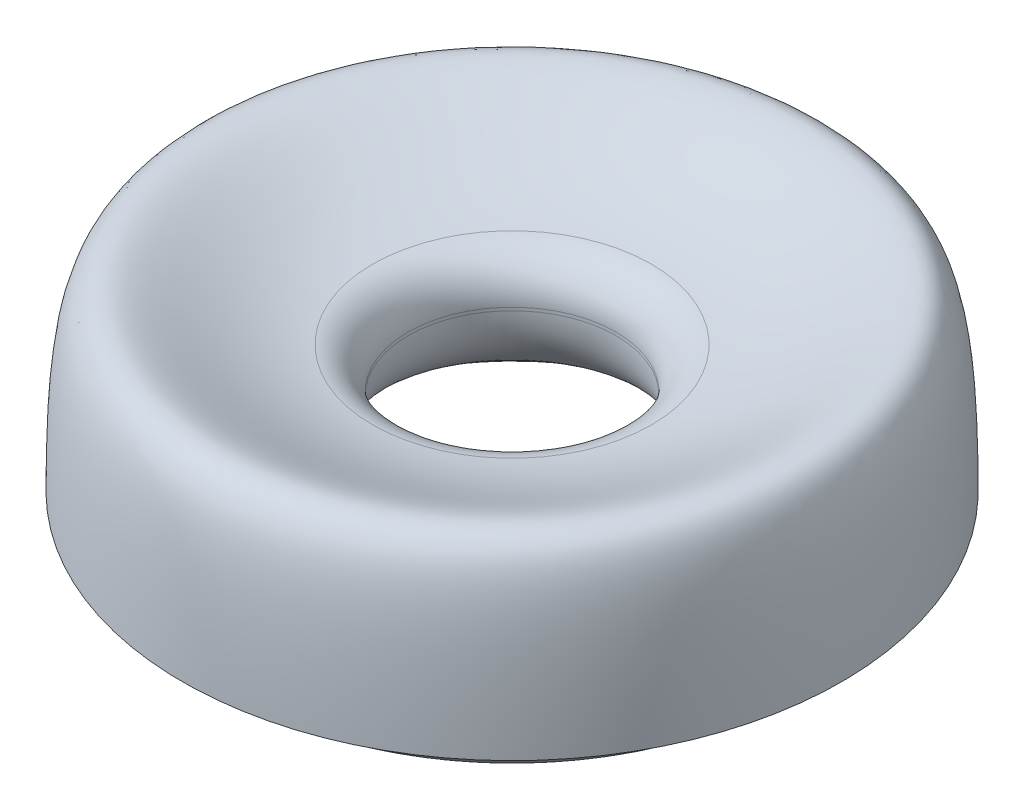
ISO-10303-21;
HEADER;
FILE_DESCRIPTION(('STEP AP214'),'2;1');
FILE_NAME('part.step','',(''),(''),'','','');
FILE_SCHEMA(('AUTOMOTIVE_DESIGN { 1 0 10303 214 1 1 1 1 }'));
ENDSEC;
DATA;
#1=APPLICATION_CONTEXT('core data for automotive mechanical design processes');
#2=APPLICATION_PROTOCOL_DEFINITION('international standard','automotive_design',2000,#1);
#3=PRODUCT_CONTEXT('',#1,'mechanical');
#4=PRODUCT('Part','Part','',(#3));
#5=PRODUCT_RELATED_PRODUCT_CATEGORY('part','',(#4));
#6=PRODUCT_DEFINITION_FORMATION('','',#4);
#7=PRODUCT_DEFINITION_CONTEXT('part definition',#1,'design');
#8=PRODUCT_DEFINITION('design','',#6,#7);
#9=PRODUCT_DEFINITION_SHAPE('','',#8);
#10=(LENGTH_UNIT() NAMED_UNIT(*) SI_UNIT(.MILLI.,.METRE.));
#11=(NAMED_UNIT(*) PLANE_ANGLE_UNIT() SI_UNIT($,.RADIAN.));
#12=(NAMED_UNIT(*) SI_UNIT($,.STERADIAN.) SOLID_ANGLE_UNIT());
#13=UNCERTAINTY_MEASURE_WITH_UNIT(LENGTH_MEASURE(1.E-05),#10,'distance_accuracy_value','');
#14=(GEOMETRIC_REPRESENTATION_CONTEXT(3) GLOBAL_UNCERTAINTY_ASSIGNED_CONTEXT((#13)) GLOBAL_UNIT_ASSIGNED_CONTEXT((#10,
#11,#12)) REPRESENTATION_CONTEXT('',''));
#15=CARTESIAN_POINT('',(0.,0.,0.));
#16=DIRECTION('',(0.,0.,1.));
#17=DIRECTION('',(1.,0.,0.));
#18=AXIS2_PLACEMENT_3D('',#15,#16,#17);
#19=CARTESIAN_POINT('',(0.,111.,1.02695629777827E-12));
#20=DIRECTION('',(0.,1.,0.));
#21=DIRECTION('',(0.,0.,1.));
#22=AXIS2_PLACEMENT_3D('',#19,#20,#21);
#23=PLANE('',#22);
#24=CARTESIAN_POINT('',(0.,111.,0.));
#25=DIRECTION('',(0.,1.,0.));
#26=DIRECTION('',(0.,0.,1.));
#27=AXIS2_PLACEMENT_3D('',#24,#25,#26);
#28=CIRCLE('',#27,5.5752694107408);
#29=CARTESIAN_POINT('',(0.,111.,5.5752694107408));
#30=VERTEX_POINT('',#29);
#31=EDGE_CURVE('E10',#30,#30,#28,.T.);
#32=ORIENTED_EDGE('',*,*,#31,.T.);
#33=EDGE_LOOP('',(#32));
#34=FACE_BOUND('',#33,.T.);
#35=CARTESIAN_POINT('',(0.,111.,0.));
#36=DIRECTION('',(0.,-1.,0.));
#37=DIRECTION('',(0.,0.,-1.));
#38=AXIS2_PLACEMENT_3D('',#35,#36,#37);
#39=CIRCLE('',#38,6.42816439104218);
#40=CARTESIAN_POINT('',(0.,111.,-6.42816439104218));
#41=VERTEX_POINT('',#40);
#42=EDGE_CURVE('E71',#41,#41,#39,.T.);
#43=ORIENTED_EDGE('',*,*,#42,.T.);
#44=EDGE_LOOP('',(#43));
#45=FACE_BOUND('',#44,.T.);
#46=ADVANCED_FACE('F39',(#34,#45),#23,.F.);
#47=CARTESIAN_POINT('',(0.,111.,4.92816439104217));
#48=CARTESIAN_POINT('',(0.,112.000000179911,4.92816439104217));
#49=CARTESIAN_POINT('',(0.,112.000000179911,2.5));
#50=CARTESIAN_POINT('',(0.,114.,2.5));
#51=B_SPLINE_CURVE_WITH_KNOTS('',3,(#47,#48,#49,#50),.UNSPECIFIED.,.F.,.F.,(4,4),(0.,1.),.UNSPECIFIED.);
#52=CARTESIAN_POINT('',(0.,103.198398653891,0.));
#53=DIRECTION('',(0.,-1.,0.));
#54=AXIS1_PLACEMENT('',#52,#53);
#55=SURFACE_OF_REVOLUTION('',#51,#54);
#56=CARTESIAN_POINT('',(0.,111.383129300292,0.));
#57=DIRECTION('',(0.,-1.,0.));
#58=DIRECTION('',(0.,0.,-1.));
#59=AXIS2_PLACEMENT_3D('',#56,#57,#58);
#60=CIRCLE('',#59,4.78820490268415);
#61=CARTESIAN_POINT('',(0.,111.383129300292,-4.78820490268415));
#62=VERTEX_POINT('',#61);
#63=EDGE_CURVE('E46',#62,#62,#60,.T.);
#64=ORIENTED_EDGE('',*,*,#63,.T.);
#65=EDGE_LOOP('',(#64));
#66=FACE_BOUND('',#65,.T.);
#67=CARTESIAN_POINT('',(0.,114.,0.));
#68=DIRECTION('',(0.,-1.,0.));
#69=DIRECTION('',(0.,0.,-1.));
#70=AXIS2_PLACEMENT_3D('',#67,#68,#69);
#71=CIRCLE('',#70,2.5);
#72=CARTESIAN_POINT('',(0.,114.,-2.5));
#73=VERTEX_POINT('',#72);
#74=EDGE_CURVE('E59',#73,#73,#71,.T.);
#75=ORIENTED_EDGE('',*,*,#74,.F.);
#76=EDGE_LOOP('',(#75));
#77=FACE_BOUND('',#76,.T.);
#78=ADVANCED_FACE('F95',(#66,#77),#55,.T.);
#79=CARTESIAN_POINT('',(0.,103.198398653891,0.));
#80=DIRECTION('',(0.,-1.,0.));
#81=DIRECTION('',(0.,0.,-1.));
#82=AXIS2_PLACEMENT_3D('',#79,#80,#81);
#83=CYLINDRICAL_SURFACE('',#82,2.5);
#84=CARTESIAN_POINT('',(0.,114.075103032978,0.));
#85=DIRECTION('',(0.,1.,0.));
#86=DIRECTION('',(0.,0.,1.));
#87=AXIS2_PLACEMENT_3D('',#84,#85,#86);
#88=CIRCLE('',#87,2.5);
#89=CARTESIAN_POINT('',(0.,114.075103032978,2.5));
#90=VERTEX_POINT('',#89);
#91=EDGE_CURVE('E50',#90,#90,#88,.T.);
#92=ORIENTED_EDGE('',*,*,#91,.T.);
#93=EDGE_LOOP('',(#92));
#94=FACE_BOUND('',#93,.T.);
#95=ORIENTED_EDGE('',*,*,#74,.T.);
#96=EDGE_LOOP('',(#95));
#97=FACE_BOUND('',#96,.T.);
#98=ADVANCED_FACE('F90',(#94,#97),#83,.F.);
#99=CARTESIAN_POINT('',(0.,112.,7.92816439104218));
#100=CARTESIAN_POINT('',(0.,119.236034271556,7.92816439104218));
#101=CARTESIAN_POINT('',(0.,115.,6.5));
#102=CARTESIAN_POINT('',(0.,115.,2.5));
#103=B_SPLINE_CURVE_WITH_KNOTS('',3,(#99,#100,#101,#102),.UNSPECIFIED.,.F.,.F.,(4,4),(0.,1.),.UNSPECIFIED.);
#104=CARTESIAN_POINT('',(0.,103.198398653891,0.));
#105=DIRECTION('',(0.,-1.,0.));
#106=AXIS1_PLACEMENT('',#104,#105);
#107=SURFACE_OF_REVOLUTION('',#103,#106);
#108=CARTESIAN_POINT('',(0.,115.064021577169,0.));
#109=DIRECTION('',(0.,-1.,0.));
#110=DIRECTION('',(0.,0.,-1.));
#111=AXIS2_PLACEMENT_3D('',#108,#109,#110);
#112=CIRCLE('',#111,3.35154087108938);
#113=CARTESIAN_POINT('',(0.,115.064021577169,-3.35154087108938));
#114=VERTEX_POINT('',#113);
#115=EDGE_CURVE('E54',#114,#114,#112,.T.);
#116=ORIENTED_EDGE('',*,*,#115,.T.);
#117=EDGE_LOOP('',(#116));
#118=FACE_BOUND('',#117,.T.);
#119=CARTESIAN_POINT('',(0.,112.,0.));
#120=DIRECTION('',(0.,-1.,0.));
#121=DIRECTION('',(0.,0.,-1.));
#122=AXIS2_PLACEMENT_3D('',#119,#120,#121);
#123=CIRCLE('',#122,7.92816439104218);
#124=CARTESIAN_POINT('',(0.,112.,-7.92816439104218));
#125=VERTEX_POINT('',#124);
#126=EDGE_CURVE('E62',#125,#125,#123,.T.);
#127=ORIENTED_EDGE('',*,*,#126,.F.);
#128=EDGE_LOOP('',(#127));
#129=FACE_BOUND('',#128,.T.);
#130=ADVANCED_FACE('F85',(#118,#129),#107,.F.);
#131=CARTESIAN_POINT('',(0.,112.,-3.10862446895037E-11));
#132=DIRECTION('',(0.,-1.,0.));
#133=DIRECTION('',(0.,0.,-1.));
#134=AXIS2_PLACEMENT_3D('',#131,#132,#133);
#135=PLANE('',#134);
#136=ORIENTED_EDGE('',*,*,#126,.T.);
#137=EDGE_LOOP('',(#136));
#138=FACE_BOUND('',#137,.T.);
#139=CARTESIAN_POINT('',(0.,112.,0.));
#140=DIRECTION('',(0.,-1.,0.));
#141=DIRECTION('',(0.,0.,-1.));
#142=AXIS2_PLACEMENT_3D('',#139,#140,#141);
#143=CIRCLE('',#142,6.92816439104218);
#144=CARTESIAN_POINT('',(0.,112.,-6.92816439104218));
#145=VERTEX_POINT('',#144);
#146=EDGE_CURVE('E65',#145,#145,#143,.T.);
#147=ORIENTED_EDGE('',*,*,#146,.F.);
#148=EDGE_LOOP('',(#147));
#149=FACE_BOUND('',#148,.T.);
#150=ADVANCED_FACE('F89',(#138,#149),#135,.T.);
#151=CARTESIAN_POINT('',(0.,103.198398653891,0.));
#152=DIRECTION('',(0.,-1.,0.));
#153=DIRECTION('',(0.,0.,-1.));
#154=AXIS2_PLACEMENT_3D('',#151,#152,#153);
#155=CYLINDRICAL_SURFACE('',#154,6.92816439104218);
#156=CARTESIAN_POINT('',(0.,111.5,0.));
#157=DIRECTION('',(0.,-1.,0.));
#158=DIRECTION('',(0.,0.,-1.));
#159=AXIS2_PLACEMENT_3D('',#156,#157,#158);
#160=CIRCLE('',#159,6.92816439104218);
#161=CARTESIAN_POINT('',(0.,111.5,-6.92816439104218));
#162=VERTEX_POINT('',#161);
#163=EDGE_CURVE('E68',#162,#162,#160,.T.);
#164=ORIENTED_EDGE('',*,*,#163,.F.);
#165=EDGE_LOOP('',(#164));
#166=FACE_BOUND('',#165,.T.);
#167=ORIENTED_EDGE('',*,*,#146,.T.);
#168=EDGE_LOOP('',(#167));
#169=FACE_BOUND('',#168,.T.);
#170=ADVANCED_FACE('F109',(#166,#169),#155,.T.);
#171=CARTESIAN_POINT('',(0.,111.5,0.));
#172=DIRECTION('',(0.,-1.,0.));
#173=DIRECTION('',(0.,0.,-1.));
#174=AXIS2_PLACEMENT_3D('',#171,#172,#173);
#175=TOROIDAL_SURFACE('',#174,6.42816439104218,0.5);
#176=ORIENTED_EDGE('',*,*,#42,.F.);
#177=EDGE_LOOP('',(#176));
#178=FACE_BOUND('',#177,.T.);
#179=ORIENTED_EDGE('',*,*,#163,.T.);
#180=EDGE_LOOP('',(#179));
#181=FACE_BOUND('',#180,.T.);
#182=ADVANCED_FACE('F102',(#178,#181),#175,.T.);
#183=CARTESIAN_POINT('',(0.,114.075103032978,0.));
#184=DIRECTION('',(0.,1.,0.));
#185=DIRECTION('',(0.,0.,1.));
#186=AXIS2_PLACEMENT_3D('',#183,#184,#185);
#187=TOROIDAL_SURFACE('',#186,3.5,1.);
#188=ORIENTED_EDGE('',*,*,#91,.F.);
#189=EDGE_LOOP('',(#188));
#190=FACE_BOUND('',#189,.T.);
#191=ORIENTED_EDGE('',*,*,#115,.F.);
#192=EDGE_LOOP('',(#191));
#193=FACE_BOUND('',#192,.T.);
#194=ADVANCED_FACE('F100',(#190,#193),#187,.T.);
#195=CARTESIAN_POINT('',(0.,112.,0.));
#196=DIRECTION('',(0.,-1.,0.));
#197=DIRECTION('',(0.,0.,-1.));
#198=AXIS2_PLACEMENT_3D('',#195,#196,#197);
#199=TOROIDAL_SURFACE('',#198,5.5752694107408,1.);
#200=ORIENTED_EDGE('',*,*,#31,.F.);
#201=EDGE_LOOP('',(#200));
#202=FACE_BOUND('',#201,.T.);
#203=ORIENTED_EDGE('',*,*,#63,.F.);
#204=EDGE_LOOP('',(#203));
#205=FACE_BOUND('',#204,.T.);
#206=ADVANCED_FACE('F41',(#202,#205),#199,.T.);
#207=CLOSED_SHELL('',(#46,#78,#98,#130,#150,#170,#182,#194,#206));
#208=MANIFOLD_SOLID_BREP('B2',#207);
#209=ADVANCED_BREP_SHAPE_REPRESENTATION('',(#18,#208),#14);
#210=SHAPE_DEFINITION_REPRESENTATION(#9,#209);
ENDSEC;
END-ISO-10303-21;
